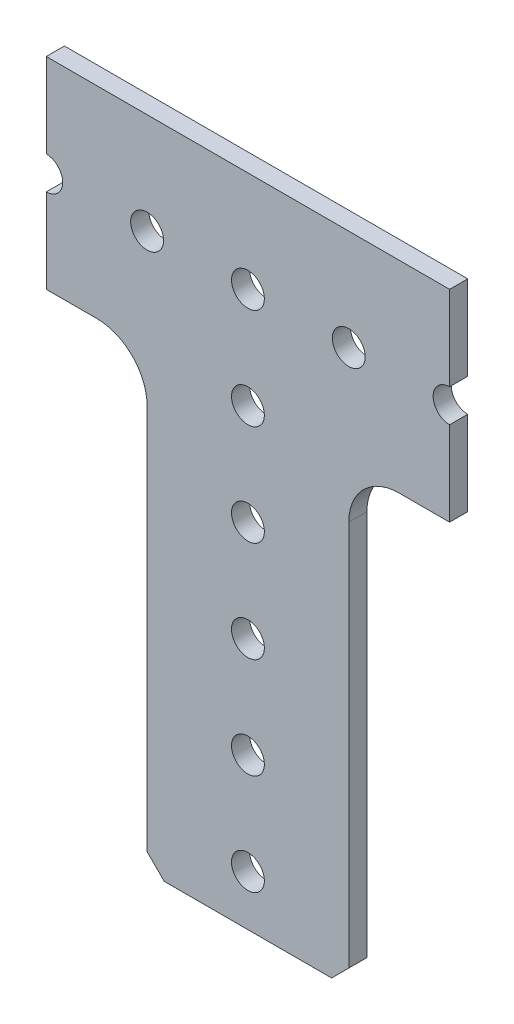
ISO-10303-21;
HEADER;
FILE_DESCRIPTION(('STEP AP214'),'2;1');
FILE_NAME('part.step','',(''),(''),'','','');
FILE_SCHEMA(('AUTOMOTIVE_DESIGN { 1 0 10303 214 1 1 1 1 }'));
ENDSEC;
DATA;
#1=APPLICATION_CONTEXT('core data for automotive mechanical design processes');
#2=APPLICATION_PROTOCOL_DEFINITION('international standard','automotive_design',2000,#1);
#3=PRODUCT_CONTEXT('',#1,'mechanical');
#4=PRODUCT('Part','Part','',(#3));
#5=PRODUCT_RELATED_PRODUCT_CATEGORY('part','',(#4));
#6=PRODUCT_DEFINITION_FORMATION('','',#4);
#7=PRODUCT_DEFINITION_CONTEXT('part definition',#1,'design');
#8=PRODUCT_DEFINITION('design','',#6,#7);
#9=PRODUCT_DEFINITION_SHAPE('','',#8);
#10=(LENGTH_UNIT() NAMED_UNIT(*) SI_UNIT(.MILLI.,.METRE.));
#11=(NAMED_UNIT(*) PLANE_ANGLE_UNIT() SI_UNIT($,.RADIAN.));
#12=(NAMED_UNIT(*) SI_UNIT($,.STERADIAN.) SOLID_ANGLE_UNIT());
#13=UNCERTAINTY_MEASURE_WITH_UNIT(LENGTH_MEASURE(1.E-05),#10,'distance_accuracy_value','');
#14=(GEOMETRIC_REPRESENTATION_CONTEXT(3) GLOBAL_UNCERTAINTY_ASSIGNED_CONTEXT((#13)) GLOBAL_UNIT_ASSIGNED_CONTEXT((#10,
#11,#12)) REPRESENTATION_CONTEXT('',''));
#15=CARTESIAN_POINT('',(0.,0.,0.));
#16=DIRECTION('',(0.,0.,1.));
#17=DIRECTION('',(1.,0.,0.));
#18=AXIS2_PLACEMENT_3D('',#15,#16,#17);
#19=CARTESIAN_POINT('',(44.45,-57.15,2.286));
#20=DIRECTION('',(0.,0.,1.));
#21=DIRECTION('',(1.,0.,0.));
#22=AXIS2_PLACEMENT_3D('',#19,#20,#21);
#23=PLANE('',#22);
#24=CARTESIAN_POINT('',(0.,-38.1,2.286));
#25=DIRECTION('',(0.,0.,-1.));
#26=DIRECTION('',(-1.,0.,0.));
#27=AXIS2_PLACEMENT_3D('',#24,#25,#26);
#28=CIRCLE('',#27,2.0701);
#29=CARTESIAN_POINT('',(-2.0701,-38.1,2.286));
#30=VERTEX_POINT('',#29);
#31=EDGE_CURVE('E307',#30,#30,#28,.T.);
#32=ORIENTED_EDGE('',*,*,#31,.T.);
#33=EDGE_LOOP('',(#32));
#34=FACE_BOUND('',#33,.T.);
#35=CARTESIAN_POINT('',(0.,-12.7,2.286));
#36=DIRECTION('',(0.,0.,-1.));
#37=DIRECTION('',(-1.,0.,0.));
#38=AXIS2_PLACEMENT_3D('',#35,#36,#37);
#39=CIRCLE('',#38,2.0701);
#40=CARTESIAN_POINT('',(-2.0701,-12.7,2.286));
#41=VERTEX_POINT('',#40);
#42=EDGE_CURVE('E310',#41,#41,#39,.T.);
#43=ORIENTED_EDGE('',*,*,#42,.T.);
#44=EDGE_LOOP('',(#43));
#45=FACE_BOUND('',#44,.T.);
#46=CARTESIAN_POINT('',(12.7,12.7,2.286));
#47=DIRECTION('',(0.,0.,-1.));
#48=DIRECTION('',(-1.,0.,0.));
#49=AXIS2_PLACEMENT_3D('',#46,#47,#48);
#50=CIRCLE('',#49,2.0701);
#51=CARTESIAN_POINT('',(10.6299,12.7,2.286));
#52=VERTEX_POINT('',#51);
#53=EDGE_CURVE('E313',#52,#52,#50,.T.);
#54=ORIENTED_EDGE('',*,*,#53,.T.);
#55=EDGE_LOOP('',(#54));
#56=FACE_BOUND('',#55,.T.);
#57=CARTESIAN_POINT('',(-12.7,12.7,2.286));
#58=DIRECTION('',(0.,0.,-1.));
#59=DIRECTION('',(-1.,0.,0.));
#60=AXIS2_PLACEMENT_3D('',#57,#58,#59);
#61=CIRCLE('',#60,2.0701);
#62=CARTESIAN_POINT('',(-14.7701,12.7,2.286));
#63=VERTEX_POINT('',#62);
#64=EDGE_CURVE('E316',#63,#63,#61,.T.);
#65=ORIENTED_EDGE('',*,*,#64,.T.);
#66=EDGE_LOOP('',(#65));
#67=FACE_BOUND('',#66,.T.);
#68=CARTESIAN_POINT('',(0.,12.7,2.286));
#69=DIRECTION('',(0.,0.,-1.));
#70=DIRECTION('',(-1.,0.,0.));
#71=AXIS2_PLACEMENT_3D('',#68,#69,#70);
#72=CIRCLE('',#71,2.0701);
#73=CARTESIAN_POINT('',(-2.0701,12.7,2.286));
#74=VERTEX_POINT('',#73);
#75=EDGE_CURVE('E322',#74,#74,#72,.T.);
#76=ORIENTED_EDGE('',*,*,#75,.T.);
#77=EDGE_LOOP('',(#76));
#78=FACE_BOUND('',#77,.T.);
#79=CARTESIAN_POINT('',(0.,0.,2.286));
#80=DIRECTION('',(0.,0.,-1.));
#81=DIRECTION('',(-1.,0.,0.));
#82=AXIS2_PLACEMENT_3D('',#79,#80,#81);
#83=CIRCLE('',#82,2.0701);
#84=CARTESIAN_POINT('',(-2.0701,0.,2.286));
#85=VERTEX_POINT('',#84);
#86=EDGE_CURVE('E327',#85,#85,#83,.T.);
#87=ORIENTED_EDGE('',*,*,#86,.T.);
#88=EDGE_LOOP('',(#87));
#89=FACE_BOUND('',#88,.T.);
#90=CARTESIAN_POINT('',(0.,-25.4,2.286));
#91=DIRECTION('',(0.,0.,-1.));
#92=DIRECTION('',(-1.,0.,0.));
#93=AXIS2_PLACEMENT_3D('',#90,#91,#92);
#94=CIRCLE('',#93,2.0701);
#95=CARTESIAN_POINT('',(-2.0701,-25.4,2.286));
#96=VERTEX_POINT('',#95);
#97=EDGE_CURVE('E329',#96,#96,#94,.T.);
#98=ORIENTED_EDGE('',*,*,#97,.T.);
#99=EDGE_LOOP('',(#98));
#100=FACE_BOUND('',#99,.T.);
#101=CARTESIAN_POINT('',(0.,-50.8,2.286));
#102=DIRECTION('',(0.,0.,-1.));
#103=DIRECTION('',(-1.,0.,0.));
#104=AXIS2_PLACEMENT_3D('',#101,#102,#103);
#105=CIRCLE('',#104,2.0701);
#106=CARTESIAN_POINT('',(-2.07009999999999,-50.8,2.286));
#107=VERTEX_POINT('',#106);
#108=EDGE_CURVE('E226',#107,#107,#105,.T.);
#109=ORIENTED_EDGE('',*,*,#108,.T.);
#110=EDGE_LOOP('',(#109));
#111=FACE_BOUND('',#110,.T.);
#112=DIRECTION('',(-1.,0.,0.));
#113=VECTOR('',#112,1.);
#114=CARTESIAN_POINT('',(0.,0.,2.286));
#115=LINE('',#114,#113);
#116=CARTESIAN_POINT('',(19.05,0.,2.286));
#117=VERTEX_POINT('',#116);
#118=CARTESIAN_POINT('',(25.4000000000024,0.,2.286));
#119=VERTEX_POINT('',#118);
#120=EDGE_CURVE('E236',#117,#119,#115,.F.);
#121=ORIENTED_EDGE('',*,*,#120,.T.);
#122=DIRECTION('',(0.,1.,0.));
#123=VECTOR('',#122,1.);
#124=CARTESIAN_POINT('',(25.4000000000021,-57.1499999999999,2.286));
#125=LINE('',#124,#123);
#126=CARTESIAN_POINT('',(25.4000000000024,10.6299,2.286));
#127=VERTEX_POINT('',#126);
#128=EDGE_CURVE('E173',#119,#127,#125,.T.);
#129=ORIENTED_EDGE('',*,*,#128,.T.);
#130=CARTESIAN_POINT('',(25.4,12.7,2.286));
#131=DIRECTION('',(0.,0.,-1.));
#132=DIRECTION('',(-1.,0.,0.));
#133=AXIS2_PLACEMENT_3D('',#130,#131,#132);
#134=CIRCLE('',#133,2.0701);
#135=CARTESIAN_POINT('',(25.4000000000025,14.7701,2.286));
#136=VERTEX_POINT('',#135);
#137=EDGE_CURVE('E325',#127,#136,#134,.T.);
#138=ORIENTED_EDGE('',*,*,#137,.T.);
#139=CARTESIAN_POINT('',(25.4000000000025,25.4,2.286));
#140=VERTEX_POINT('',#139);
#141=EDGE_CURVE('E54',#136,#140,#125,.T.);
#142=ORIENTED_EDGE('',*,*,#141,.T.);
#143=DIRECTION('',(1.,0.,0.));
#144=VECTOR('',#143,1.);
#145=CARTESIAN_POINT('',(-44.45,25.4,2.286));
#146=LINE('',#145,#144);
#147=CARTESIAN_POINT('',(-25.3999999993521,25.4,2.286));
#148=VERTEX_POINT('',#147);
#149=EDGE_CURVE('E40',#140,#148,#146,.F.);
#150=ORIENTED_EDGE('',*,*,#149,.T.);
#151=DIRECTION('',(0.,-1.,0.));
#152=VECTOR('',#151,1.);
#153=CARTESIAN_POINT('',(-25.3999999993528,-57.1499999999993,2.286));
#154=LINE('',#153,#152);
#155=CARTESIAN_POINT('',(-25.3999999993522,14.7701,2.286));
#156=VERTEX_POINT('',#155);
#157=EDGE_CURVE('E197',#148,#156,#154,.T.);
#158=ORIENTED_EDGE('',*,*,#157,.T.);
#159=CARTESIAN_POINT('',(-25.4,12.7,2.286));
#160=DIRECTION('',(0.,0.,-1.));
#161=DIRECTION('',(-1.,0.,0.));
#162=AXIS2_PLACEMENT_3D('',#159,#160,#161);
#163=CIRCLE('',#162,2.0701);
#164=CARTESIAN_POINT('',(-25.3999999993522,10.6299,2.286));
#165=VERTEX_POINT('',#164);
#166=EDGE_CURVE('E319',#156,#165,#163,.T.);
#167=ORIENTED_EDGE('',*,*,#166,.T.);
#168=CARTESIAN_POINT('',(-25.3999999993523,0.,2.286));
#169=VERTEX_POINT('',#168);
#170=EDGE_CURVE('E194',#165,#169,#154,.T.);
#171=ORIENTED_EDGE('',*,*,#170,.T.);
#172=DIRECTION('',(1.,0.,0.));
#173=VECTOR('',#172,1.);
#174=CARTESIAN_POINT('',(0.,0.,2.286));
#175=LINE('',#174,#173);
#176=CARTESIAN_POINT('',(-19.05,0.,2.286));
#177=VERTEX_POINT('',#176);
#178=EDGE_CURVE('E268',#177,#169,#175,.F.);
#179=ORIENTED_EDGE('',*,*,#178,.F.);
#180=CARTESIAN_POINT('',(-19.05,-6.34999999999999,2.286));
#181=DIRECTION('',(0.,0.,1.));
#182=DIRECTION('',(1.,0.,0.));
#183=AXIS2_PLACEMENT_3D('',#180,#181,#182);
#184=CIRCLE('',#183,6.35000000000001);
#185=CARTESIAN_POINT('',(-12.7,-6.34999999999998,2.286));
#186=VERTEX_POINT('',#185);
#187=EDGE_CURVE('E265',#177,#186,#184,.F.);
#188=ORIENTED_EDGE('',*,*,#187,.T.);
#189=DIRECTION('',(0.,-1.,0.));
#190=VECTOR('',#189,1.);
#191=CARTESIAN_POINT('',(-12.7,0.,2.286));
#192=LINE('',#191,#190);
#193=CARTESIAN_POINT('',(-12.7,-54.991,2.286));
#194=VERTEX_POINT('',#193);
#195=EDGE_CURVE('E263',#194,#186,#192,.F.);
#196=ORIENTED_EDGE('',*,*,#195,.F.);
#197=DIRECTION('',(0.707106781186547,-0.707106781186548,0.));
#198=VECTOR('',#197,1.);
#199=CARTESIAN_POINT('',(-10.541,-57.15,2.286));
#200=LINE('',#199,#198);
#201=CARTESIAN_POINT('',(-10.541,-57.15,2.286));
#202=VERTEX_POINT('',#201);
#203=EDGE_CURVE('E257',#202,#194,#200,.F.);
#204=ORIENTED_EDGE('',*,*,#203,.F.);
#205=DIRECTION('',(1.,0.,0.));
#206=VECTOR('',#205,1.);
#207=CARTESIAN_POINT('',(-12.7,-57.15,2.286));
#208=LINE('',#207,#206);
#209=CARTESIAN_POINT('',(10.541,-57.15,2.286));
#210=VERTEX_POINT('',#209);
#211=EDGE_CURVE('E252',#202,#210,#208,.T.);
#212=ORIENTED_EDGE('',*,*,#211,.T.);
#213=DIRECTION('',(-0.707106781186547,-0.707106781186548,0.));
#214=VECTOR('',#213,1.);
#215=CARTESIAN_POINT('',(12.7,-54.991,2.286));
#216=LINE('',#215,#214);
#217=CARTESIAN_POINT('',(12.7,-54.991,2.286));
#218=VERTEX_POINT('',#217);
#219=EDGE_CURVE('E247',#210,#218,#216,.F.);
#220=ORIENTED_EDGE('',*,*,#219,.T.);
#221=DIRECTION('',(0.,1.,0.));
#222=VECTOR('',#221,1.);
#223=CARTESIAN_POINT('',(12.7,0.,2.286));
#224=LINE('',#223,#222);
#225=CARTESIAN_POINT('',(12.7,-6.34999999999998,2.286));
#226=VERTEX_POINT('',#225);
#227=EDGE_CURVE('E241',#218,#226,#224,.T.);
#228=ORIENTED_EDGE('',*,*,#227,.T.);
#229=CARTESIAN_POINT('',(19.05,-6.34999999999998,2.286));
#230=DIRECTION('',(0.,0.,1.));
#231=DIRECTION('',(1.,0.,0.));
#232=AXIS2_PLACEMENT_3D('',#229,#230,#231);
#233=CIRCLE('',#232,6.35000000000001);
#234=EDGE_CURVE('E303',#226,#117,#233,.F.);
#235=ORIENTED_EDGE('',*,*,#234,.T.);
#236=EDGE_LOOP('',(#121,#129,#138,#142,#150,#158,#167,#171,#179,#188,#196,#204,#212,#220,#228,#235));
#237=FACE_BOUND('',#236,.T.);
#238=ADVANCED_FACE('F37',(#34,#45,#56,#67,#78,#89,#100,#111,#237),#23,.T.);
#239=CARTESIAN_POINT('',(-44.45,25.4,2.286));
#240=DIRECTION('',(0.,-1.,0.));
#241=DIRECTION('',(0.,0.,-1.));
#242=AXIS2_PLACEMENT_3D('',#239,#240,#241);
#243=PLANE('',#242);
#244=DIRECTION('',(0.,0.,1.));
#245=VECTOR('',#244,1.);
#246=CARTESIAN_POINT('',(25.4000000000025,25.4,2.28600000000027));
#247=LINE('',#246,#245);
#248=CARTESIAN_POINT('',(25.4000000000025,25.4,0.));
#249=VERTEX_POINT('',#248);
#250=EDGE_CURVE('E61',#249,#140,#247,.T.);
#251=ORIENTED_EDGE('',*,*,#250,.F.);
#252=DIRECTION('',(1.,0.,0.));
#253=VECTOR('',#252,1.);
#254=CARTESIAN_POINT('',(44.45,25.4,0.));
#255=LINE('',#254,#253);
#256=CARTESIAN_POINT('',(-25.3999999993521,25.4,0.));
#257=VERTEX_POINT('',#256);
#258=EDGE_CURVE('E225',#249,#257,#255,.F.);
#259=ORIENTED_EDGE('',*,*,#258,.T.);
#260=DIRECTION('',(0.,0.,-1.));
#261=VECTOR('',#260,1.);
#262=CARTESIAN_POINT('',(-25.3999999993521,25.4,2.286));
#263=LINE('',#262,#261);
#264=EDGE_CURVE('E196',#148,#257,#263,.T.);
#265=ORIENTED_EDGE('',*,*,#264,.F.);
#266=ORIENTED_EDGE('',*,*,#149,.F.);
#267=EDGE_LOOP('',(#251,#259,#265,#266));
#268=FACE_BOUND('',#267,.T.);
#269=ADVANCED_FACE('F421',(#268),#243,.F.);
#270=CARTESIAN_POINT('',(44.45,-57.15,0.));
#271=DIRECTION('',(0.,0.,1.));
#272=DIRECTION('',(1.,0.,0.));
#273=AXIS2_PLACEMENT_3D('',#270,#271,#272);
#274=PLANE('',#273);
#275=CARTESIAN_POINT('',(0.,-38.1,0.));
#276=DIRECTION('',(0.,0.,-1.));
#277=DIRECTION('',(-1.,0.,0.));
#278=AXIS2_PLACEMENT_3D('',#275,#276,#277);
#279=CIRCLE('',#278,2.0701);
#280=CARTESIAN_POINT('',(-2.0701,-38.1,0.));
#281=VERTEX_POINT('',#280);
#282=EDGE_CURVE('E230',#281,#281,#279,.T.);
#283=ORIENTED_EDGE('',*,*,#282,.F.);
#284=EDGE_LOOP('',(#283));
#285=FACE_BOUND('',#284,.T.);
#286=CARTESIAN_POINT('',(0.,-12.7,0.));
#287=DIRECTION('',(0.,0.,-1.));
#288=DIRECTION('',(-1.,0.,0.));
#289=AXIS2_PLACEMENT_3D('',#286,#287,#288);
#290=CIRCLE('',#289,2.0701);
#291=CARTESIAN_POINT('',(-2.0701,-12.7,0.));
#292=VERTEX_POINT('',#291);
#293=EDGE_CURVE('E279',#292,#292,#290,.T.);
#294=ORIENTED_EDGE('',*,*,#293,.F.);
#295=EDGE_LOOP('',(#294));
#296=FACE_BOUND('',#295,.T.);
#297=CARTESIAN_POINT('',(12.7,12.7,0.));
#298=DIRECTION('',(0.,0.,-1.));
#299=DIRECTION('',(-1.,0.,0.));
#300=AXIS2_PLACEMENT_3D('',#297,#298,#299);
#301=CIRCLE('',#300,2.0701);
#302=CARTESIAN_POINT('',(10.6299,12.7,0.));
#303=VERTEX_POINT('',#302);
#304=EDGE_CURVE('E282',#303,#303,#301,.T.);
#305=ORIENTED_EDGE('',*,*,#304,.F.);
#306=EDGE_LOOP('',(#305));
#307=FACE_BOUND('',#306,.T.);
#308=CARTESIAN_POINT('',(-12.7,12.7,0.));
#309=DIRECTION('',(0.,0.,-1.));
#310=DIRECTION('',(-1.,0.,0.));
#311=AXIS2_PLACEMENT_3D('',#308,#309,#310);
#312=CIRCLE('',#311,2.0701);
#313=CARTESIAN_POINT('',(-14.7701,12.7,0.));
#314=VERTEX_POINT('',#313);
#315=EDGE_CURVE('E285',#314,#314,#312,.T.);
#316=ORIENTED_EDGE('',*,*,#315,.F.);
#317=EDGE_LOOP('',(#316));
#318=FACE_BOUND('',#317,.T.);
#319=CARTESIAN_POINT('',(0.,12.7,0.));
#320=DIRECTION('',(0.,0.,-1.));
#321=DIRECTION('',(-1.,0.,0.));
#322=AXIS2_PLACEMENT_3D('',#319,#320,#321);
#323=CIRCLE('',#322,2.0701);
#324=CARTESIAN_POINT('',(-2.0701,12.7,0.));
#325=VERTEX_POINT('',#324);
#326=EDGE_CURVE('E291',#325,#325,#323,.T.);
#327=ORIENTED_EDGE('',*,*,#326,.F.);
#328=EDGE_LOOP('',(#327));
#329=FACE_BOUND('',#328,.T.);
#330=CARTESIAN_POINT('',(0.,0.,0.));
#331=DIRECTION('',(0.,0.,-1.));
#332=DIRECTION('',(-1.,0.,0.));
#333=AXIS2_PLACEMENT_3D('',#330,#331,#332);
#334=CIRCLE('',#333,2.0701);
#335=CARTESIAN_POINT('',(-2.0701,0.,0.));
#336=VERTEX_POINT('',#335);
#337=EDGE_CURVE('E295',#336,#336,#334,.T.);
#338=ORIENTED_EDGE('',*,*,#337,.F.);
#339=EDGE_LOOP('',(#338));
#340=FACE_BOUND('',#339,.T.);
#341=CARTESIAN_POINT('',(0.,-25.4,0.));
#342=DIRECTION('',(0.,0.,-1.));
#343=DIRECTION('',(-1.,0.,0.));
#344=AXIS2_PLACEMENT_3D('',#341,#342,#343);
#345=CIRCLE('',#344,2.0701);
#346=CARTESIAN_POINT('',(-2.0701,-25.4,0.));
#347=VERTEX_POINT('',#346);
#348=EDGE_CURVE('E298',#347,#347,#345,.T.);
#349=ORIENTED_EDGE('',*,*,#348,.F.);
#350=EDGE_LOOP('',(#349));
#351=FACE_BOUND('',#350,.T.);
#352=CARTESIAN_POINT('',(0.,-50.8,0.));
#353=DIRECTION('',(0.,0.,-1.));
#354=DIRECTION('',(-1.,0.,0.));
#355=AXIS2_PLACEMENT_3D('',#352,#353,#354);
#356=CIRCLE('',#355,2.0701);
#357=CARTESIAN_POINT('',(-2.07009999999999,-50.8,0.));
#358=VERTEX_POINT('',#357);
#359=EDGE_CURVE('E238',#358,#358,#356,.T.);
#360=ORIENTED_EDGE('',*,*,#359,.F.);
#361=EDGE_LOOP('',(#360));
#362=FACE_BOUND('',#361,.T.);
#363=DIRECTION('',(0.,1.,0.));
#364=VECTOR('',#363,1.);
#365=CARTESIAN_POINT('',(25.4000000000021,-57.1499999999999,0.));
#366=LINE('',#365,#364);
#367=CARTESIAN_POINT('',(25.4000000000024,0.,0.));
#368=VERTEX_POINT('',#367);
#369=CARTESIAN_POINT('',(25.4000000000024,10.6299,0.));
#370=VERTEX_POINT('',#369);
#371=EDGE_CURVE('E167',#368,#370,#366,.T.);
#372=ORIENTED_EDGE('',*,*,#371,.F.);
#373=DIRECTION('',(1.,0.,0.));
#374=VECTOR('',#373,1.);
#375=CARTESIAN_POINT('',(44.45,0.,0.));
#376=LINE('',#375,#374);
#377=CARTESIAN_POINT('',(19.05,0.,0.));
#378=VERTEX_POINT('',#377);
#379=EDGE_CURVE('E152',#378,#368,#376,.T.);
#380=ORIENTED_EDGE('',*,*,#379,.F.);
#381=CARTESIAN_POINT('',(19.05,-6.34999999999998,0.));
#382=DIRECTION('',(0.,0.,1.));
#383=DIRECTION('',(1.,0.,0.));
#384=AXIS2_PLACEMENT_3D('',#381,#382,#383);
#385=CIRCLE('',#384,6.35000000000001);
#386=CARTESIAN_POINT('',(12.7,-6.34999999999998,0.));
#387=VERTEX_POINT('',#386);
#388=EDGE_CURVE('E163',#387,#378,#385,.F.);
#389=ORIENTED_EDGE('',*,*,#388,.F.);
#390=DIRECTION('',(0.,1.,0.));
#391=VECTOR('',#390,1.);
#392=CARTESIAN_POINT('',(12.7,-57.15,0.));
#393=LINE('',#392,#391);
#394=CARTESIAN_POINT('',(12.7,-54.991,0.));
#395=VERTEX_POINT('',#394);
#396=EDGE_CURVE('E205',#395,#387,#393,.T.);
#397=ORIENTED_EDGE('',*,*,#396,.F.);
#398=DIRECTION('',(0.707106781186547,0.707106781186547,0.));
#399=VECTOR('',#398,1.);
#400=CARTESIAN_POINT('',(10.541,-57.15,0.));
#401=LINE('',#400,#399);
#402=CARTESIAN_POINT('',(10.541,-57.15,0.));
#403=VERTEX_POINT('',#402);
#404=EDGE_CURVE('E208',#403,#395,#401,.T.);
#405=ORIENTED_EDGE('',*,*,#404,.F.);
#406=DIRECTION('',(1.,0.,0.));
#407=VECTOR('',#406,1.);
#408=CARTESIAN_POINT('',(44.45,-57.15,0.));
#409=LINE('',#408,#407);
#410=CARTESIAN_POINT('',(-10.541,-57.15,0.));
#411=VERTEX_POINT('',#410);
#412=EDGE_CURVE('E374',#411,#403,#409,.T.);
#413=ORIENTED_EDGE('',*,*,#412,.F.);
#414=DIRECTION('',(0.707106781186547,-0.707106781186547,0.));
#415=VECTOR('',#414,1.);
#416=CARTESIAN_POINT('',(-12.7,-54.991,0.));
#417=LINE('',#416,#415);
#418=CARTESIAN_POINT('',(-12.7,-54.991,0.));
#419=VERTEX_POINT('',#418);
#420=EDGE_CURVE('E214',#419,#411,#417,.T.);
#421=ORIENTED_EDGE('',*,*,#420,.F.);
#422=DIRECTION('',(0.,1.,0.));
#423=VECTOR('',#422,1.);
#424=CARTESIAN_POINT('',(-12.7,-57.15,0.));
#425=LINE('',#424,#423);
#426=CARTESIAN_POINT('',(-12.7,-6.34999999999999,0.));
#427=VERTEX_POINT('',#426);
#428=EDGE_CURVE('E211',#427,#419,#425,.F.);
#429=ORIENTED_EDGE('',*,*,#428,.F.);
#430=CARTESIAN_POINT('',(-19.05,-6.34999999999999,0.));
#431=DIRECTION('',(0.,0.,1.));
#432=DIRECTION('',(1.,0.,0.));
#433=AXIS2_PLACEMENT_3D('',#430,#431,#432);
#434=CIRCLE('',#433,6.35000000000001);
#435=CARTESIAN_POINT('',(-19.05,0.,0.));
#436=VERTEX_POINT('',#435);
#437=EDGE_CURVE('E215',#436,#427,#434,.F.);
#438=ORIENTED_EDGE('',*,*,#437,.F.);
#439=DIRECTION('',(1.,0.,0.));
#440=VECTOR('',#439,1.);
#441=CARTESIAN_POINT('',(44.45,0.,0.));
#442=LINE('',#441,#440);
#443=CARTESIAN_POINT('',(-25.3999999993523,0.,0.));
#444=VERTEX_POINT('',#443);
#445=EDGE_CURVE('E222',#444,#436,#442,.T.);
#446=ORIENTED_EDGE('',*,*,#445,.F.);
#447=DIRECTION('',(0.,-1.,0.));
#448=VECTOR('',#447,1.);
#449=CARTESIAN_POINT('',(-25.3999999993528,-57.1499999999993,0.));
#450=LINE('',#449,#448);
#451=CARTESIAN_POINT('',(-25.3999999993522,10.6299,0.));
#452=VERTEX_POINT('',#451);
#453=EDGE_CURVE('E162',#452,#444,#450,.T.);
#454=ORIENTED_EDGE('',*,*,#453,.F.);
#455=CARTESIAN_POINT('',(-25.4,12.7,0.));
#456=DIRECTION('',(0.,0.,-1.));
#457=DIRECTION('',(-1.,0.,0.));
#458=AXIS2_PLACEMENT_3D('',#455,#456,#457);
#459=CIRCLE('',#458,2.0701);
#460=CARTESIAN_POINT('',(-25.3999999993522,14.7701,0.));
#461=VERTEX_POINT('',#460);
#462=EDGE_CURVE('E288',#461,#452,#459,.T.);
#463=ORIENTED_EDGE('',*,*,#462,.F.);
#464=EDGE_CURVE('E46',#257,#461,#450,.T.);
#465=ORIENTED_EDGE('',*,*,#464,.F.);
#466=ORIENTED_EDGE('',*,*,#258,.F.);
#467=CARTESIAN_POINT('',(25.4000000000025,14.7701,0.));
#468=VERTEX_POINT('',#467);
#469=EDGE_CURVE('E175',#468,#249,#366,.T.);
#470=ORIENTED_EDGE('',*,*,#469,.F.);
#471=CARTESIAN_POINT('',(25.4,12.7,0.));
#472=DIRECTION('',(0.,0.,-1.));
#473=DIRECTION('',(-1.,0.,0.));
#474=AXIS2_PLACEMENT_3D('',#471,#472,#473);
#475=CIRCLE('',#474,2.0701);
#476=EDGE_CURVE('E170',#370,#468,#475,.T.);
#477=ORIENTED_EDGE('',*,*,#476,.F.);
#478=EDGE_LOOP('',(#372,#380,#389,#397,#405,#413,#421,#429,#438,#446,#454,#463,#465,#466,#470,#477));
#479=FACE_BOUND('',#478,.T.);
#480=ADVANCED_FACE('F168',(#285,#296,#307,#318,#329,#340,#351,#362,#479),#274,.F.);
#481=CARTESIAN_POINT('',(25.4,12.7,2.286));
#482=DIRECTION('',(0.,0.,-1.));
#483=DIRECTION('',(-1.,0.,0.));
#484=AXIS2_PLACEMENT_3D('',#481,#482,#483);
#485=CYLINDRICAL_SURFACE('',#484,2.0701);
#486=DIRECTION('',(0.,0.,-1.));
#487=VECTOR('',#486,1.);
#488=CARTESIAN_POINT('',(25.4000000000024,10.6299,2.286));
#489=LINE('',#488,#487);
#490=EDGE_CURVE('E178',#370,#127,#489,.F.);
#491=ORIENTED_EDGE('',*,*,#490,.F.);
#492=ORIENTED_EDGE('',*,*,#476,.T.);
#493=DIRECTION('',(0.,0.,-1.));
#494=VECTOR('',#493,1.);
#495=CARTESIAN_POINT('',(25.4000000000025,14.7701,2.286));
#496=LINE('',#495,#494);
#497=EDGE_CURVE('E181',#136,#468,#496,.T.);
#498=ORIENTED_EDGE('',*,*,#497,.F.);
#499=ORIENTED_EDGE('',*,*,#137,.F.);
#500=EDGE_LOOP('',(#491,#492,#498,#499));
#501=FACE_BOUND('',#500,.T.);
#502=ADVANCED_FACE('F459',(#501),#485,.F.);
#503=CARTESIAN_POINT('',(0.,0.,0.));
#504=DIRECTION('',(0.,1.,0.));
#505=DIRECTION('',(-1.,0.,0.));
#506=AXIS2_PLACEMENT_3D('',#503,#504,#505);
#507=PLANE('',#506);
#508=DIRECTION('',(0.,0.,-1.));
#509=VECTOR('',#508,1.);
#510=CARTESIAN_POINT('',(25.4000000000024,0.,0.));
#511=LINE('',#510,#509);
#512=EDGE_CURVE('E12',#119,#368,#511,.T.);
#513=ORIENTED_EDGE('',*,*,#512,.F.);
#514=ORIENTED_EDGE('',*,*,#120,.F.);
#515=DIRECTION('',(0.,0.,1.));
#516=VECTOR('',#515,1.);
#517=CARTESIAN_POINT('',(19.05,0.,0.));
#518=LINE('',#517,#516);
#519=EDGE_CURVE('E158',#378,#117,#518,.T.);
#520=ORIENTED_EDGE('',*,*,#519,.F.);
#521=ORIENTED_EDGE('',*,*,#379,.T.);
#522=EDGE_LOOP('',(#513,#514,#520,#521));
#523=FACE_BOUND('',#522,.T.);
#524=ADVANCED_FACE('F154',(#523),#507,.F.);
#525=CARTESIAN_POINT('',(-25.4,12.7,2.286));
#526=DIRECTION('',(0.,0.,-1.));
#527=DIRECTION('',(-1.,0.,0.));
#528=AXIS2_PLACEMENT_3D('',#525,#526,#527);
#529=CYLINDRICAL_SURFACE('',#528,2.0701);
#530=DIRECTION('',(0.,0.,-1.));
#531=VECTOR('',#530,1.);
#532=CARTESIAN_POINT('',(-25.3999999993522,14.7701,2.286));
#533=LINE('',#532,#531);
#534=EDGE_CURVE('E200',#461,#156,#533,.F.);
#535=ORIENTED_EDGE('',*,*,#534,.F.);
#536=ORIENTED_EDGE('',*,*,#462,.T.);
#537=DIRECTION('',(0.,0.,-1.));
#538=VECTOR('',#537,1.);
#539=CARTESIAN_POINT('',(-25.3999999993522,10.6299,2.286));
#540=LINE('',#539,#538);
#541=EDGE_CURVE('E185',#165,#452,#540,.T.);
#542=ORIENTED_EDGE('',*,*,#541,.F.);
#543=ORIENTED_EDGE('',*,*,#166,.F.);
#544=EDGE_LOOP('',(#535,#536,#542,#543));
#545=FACE_BOUND('',#544,.T.);
#546=ADVANCED_FACE('F343',(#545),#529,.F.);
#547=CARTESIAN_POINT('',(0.,0.,0.));
#548=DIRECTION('',(0.,-1.,0.));
#549=DIRECTION('',(1.,0.,0.));
#550=AXIS2_PLACEMENT_3D('',#547,#548,#549);
#551=PLANE('',#550);
#552=ORIENTED_EDGE('',*,*,#178,.T.);
#553=DIRECTION('',(0.,0.,-1.));
#554=VECTOR('',#553,1.);
#555=CARTESIAN_POINT('',(-25.3999999993523,0.,0.));
#556=LINE('',#555,#554);
#557=EDGE_CURVE('E183',#169,#444,#556,.T.);
#558=ORIENTED_EDGE('',*,*,#557,.T.);
#559=ORIENTED_EDGE('',*,*,#445,.T.);
#560=DIRECTION('',(0.,0.,1.));
#561=VECTOR('',#560,1.);
#562=CARTESIAN_POINT('',(-19.05,0.,0.));
#563=LINE('',#562,#561);
#564=EDGE_CURVE('E234',#436,#177,#563,.T.);
#565=ORIENTED_EDGE('',*,*,#564,.T.);
#566=EDGE_LOOP('',(#552,#558,#559,#565));
#567=FACE_BOUND('',#566,.T.);
#568=ADVANCED_FACE('F353',(#567),#551,.T.);
#569=CARTESIAN_POINT('',(0.,-50.8,2.286));
#570=DIRECTION('',(0.,0.,-1.));
#571=DIRECTION('',(-1.,0.,0.));
#572=AXIS2_PLACEMENT_3D('',#569,#570,#571);
#573=CYLINDRICAL_SURFACE('',#572,2.0701);
#574=ORIENTED_EDGE('',*,*,#359,.T.);
#575=EDGE_LOOP('',(#574));
#576=FACE_BOUND('',#575,.T.);
#577=ORIENTED_EDGE('',*,*,#108,.F.);
#578=EDGE_LOOP('',(#577));
#579=FACE_BOUND('',#578,.T.);
#580=ADVANCED_FACE('F455',(#576,#579),#573,.F.);
#581=CARTESIAN_POINT('',(0.,-25.4,2.286));
#582=DIRECTION('',(0.,0.,-1.));
#583=DIRECTION('',(-1.,0.,0.));
#584=AXIS2_PLACEMENT_3D('',#581,#582,#583);
#585=CYLINDRICAL_SURFACE('',#584,2.0701);
#586=ORIENTED_EDGE('',*,*,#348,.T.);
#587=EDGE_LOOP('',(#586));
#588=FACE_BOUND('',#587,.T.);
#589=ORIENTED_EDGE('',*,*,#97,.F.);
#590=EDGE_LOOP('',(#589));
#591=FACE_BOUND('',#590,.T.);
#592=ADVANCED_FACE('F443',(#588,#591),#585,.F.);
#593=CARTESIAN_POINT('',(0.,0.,2.286));
#594=DIRECTION('',(0.,0.,-1.));
#595=DIRECTION('',(-1.,0.,0.));
#596=AXIS2_PLACEMENT_3D('',#593,#594,#595);
#597=CYLINDRICAL_SURFACE('',#596,2.0701);
#598=ORIENTED_EDGE('',*,*,#337,.T.);
#599=EDGE_LOOP('',(#598));
#600=FACE_BOUND('',#599,.T.);
#601=ORIENTED_EDGE('',*,*,#86,.F.);
#602=EDGE_LOOP('',(#601));
#603=FACE_BOUND('',#602,.T.);
#604=ADVANCED_FACE('F440',(#600,#603),#597,.F.);
#605=CARTESIAN_POINT('',(0.,12.7,2.286));
#606=DIRECTION('',(0.,0.,-1.));
#607=DIRECTION('',(-1.,0.,0.));
#608=AXIS2_PLACEMENT_3D('',#605,#606,#607);
#609=CYLINDRICAL_SURFACE('',#608,2.0701);
#610=ORIENTED_EDGE('',*,*,#326,.T.);
#611=EDGE_LOOP('',(#610));
#612=FACE_BOUND('',#611,.T.);
#613=ORIENTED_EDGE('',*,*,#75,.F.);
#614=EDGE_LOOP('',(#613));
#615=FACE_BOUND('',#614,.T.);
#616=ADVANCED_FACE('F442',(#612,#615),#609,.F.);
#617=CARTESIAN_POINT('',(-12.7,12.7,2.286));
#618=DIRECTION('',(0.,0.,-1.));
#619=DIRECTION('',(-1.,0.,0.));
#620=AXIS2_PLACEMENT_3D('',#617,#618,#619);
#621=CYLINDRICAL_SURFACE('',#620,2.0701);
#622=ORIENTED_EDGE('',*,*,#315,.T.);
#623=EDGE_LOOP('',(#622));
#624=FACE_BOUND('',#623,.T.);
#625=ORIENTED_EDGE('',*,*,#64,.F.);
#626=EDGE_LOOP('',(#625));
#627=FACE_BOUND('',#626,.T.);
#628=ADVANCED_FACE('F451',(#624,#627),#621,.F.);
#629=CARTESIAN_POINT('',(12.7,12.7,2.286));
#630=DIRECTION('',(0.,0.,-1.));
#631=DIRECTION('',(-1.,0.,0.));
#632=AXIS2_PLACEMENT_3D('',#629,#630,#631);
#633=CYLINDRICAL_SURFACE('',#632,2.0701);
#634=ORIENTED_EDGE('',*,*,#304,.T.);
#635=EDGE_LOOP('',(#634));
#636=FACE_BOUND('',#635,.T.);
#637=ORIENTED_EDGE('',*,*,#53,.F.);
#638=EDGE_LOOP('',(#637));
#639=FACE_BOUND('',#638,.T.);
#640=ADVANCED_FACE('F534',(#636,#639),#633,.F.);
#641=CARTESIAN_POINT('',(0.,-12.7,2.286));
#642=DIRECTION('',(0.,0.,-1.));
#643=DIRECTION('',(-1.,0.,0.));
#644=AXIS2_PLACEMENT_3D('',#641,#642,#643);
#645=CYLINDRICAL_SURFACE('',#644,2.0701);
#646=ORIENTED_EDGE('',*,*,#293,.T.);
#647=EDGE_LOOP('',(#646));
#648=FACE_BOUND('',#647,.T.);
#649=ORIENTED_EDGE('',*,*,#42,.F.);
#650=EDGE_LOOP('',(#649));
#651=FACE_BOUND('',#650,.T.);
#652=ADVANCED_FACE('F524',(#648,#651),#645,.F.);
#653=CARTESIAN_POINT('',(0.,-38.1,2.286));
#654=DIRECTION('',(0.,0.,-1.));
#655=DIRECTION('',(-1.,0.,0.));
#656=AXIS2_PLACEMENT_3D('',#653,#654,#655);
#657=CYLINDRICAL_SURFACE('',#656,2.0701);
#658=ORIENTED_EDGE('',*,*,#282,.T.);
#659=EDGE_LOOP('',(#658));
#660=FACE_BOUND('',#659,.T.);
#661=ORIENTED_EDGE('',*,*,#31,.F.);
#662=EDGE_LOOP('',(#661));
#663=FACE_BOUND('',#662,.T.);
#664=ADVANCED_FACE('F515',(#660,#663),#657,.F.);
#665=CARTESIAN_POINT('',(-19.05,-6.34999999999999,0.));
#666=DIRECTION('',(0.,0.,1.));
#667=DIRECTION('',(1.,0.,0.));
#668=AXIS2_PLACEMENT_3D('',#665,#666,#667);
#669=CYLINDRICAL_SURFACE('',#668,6.35000000000001);
#670=ORIENTED_EDGE('',*,*,#564,.F.);
#671=ORIENTED_EDGE('',*,*,#437,.T.);
#672=DIRECTION('',(0.,0.,1.));
#673=VECTOR('',#672,1.);
#674=CARTESIAN_POINT('',(-12.7,-6.34999999999999,0.));
#675=LINE('',#674,#673);
#676=EDGE_CURVE('E260',#186,#427,#675,.F.);
#677=ORIENTED_EDGE('',*,*,#676,.F.);
#678=ORIENTED_EDGE('',*,*,#187,.F.);
#679=EDGE_LOOP('',(#670,#671,#677,#678));
#680=FACE_BOUND('',#679,.T.);
#681=ADVANCED_FACE('F357',(#680),#669,.F.);
#682=CARTESIAN_POINT('',(-12.7,0.,0.));
#683=DIRECTION('',(-1.,0.,0.));
#684=DIRECTION('',(0.,-1.,0.));
#685=AXIS2_PLACEMENT_3D('',#682,#683,#684);
#686=PLANE('',#685);
#687=ORIENTED_EDGE('',*,*,#195,.T.);
#688=ORIENTED_EDGE('',*,*,#676,.T.);
#689=ORIENTED_EDGE('',*,*,#428,.T.);
#690=DIRECTION('',(0.,0.,1.));
#691=VECTOR('',#690,1.);
#692=CARTESIAN_POINT('',(-12.7,-54.991,2.286));
#693=LINE('',#692,#691);
#694=EDGE_CURVE('E259',#194,#419,#693,.F.);
#695=ORIENTED_EDGE('',*,*,#694,.F.);
#696=EDGE_LOOP('',(#687,#688,#689,#695));
#697=FACE_BOUND('',#696,.T.);
#698=ADVANCED_FACE('F365',(#697),#686,.T.);
#699=CARTESIAN_POINT('',(-10.541,-57.15,2.286));
#700=DIRECTION('',(-0.707106781186548,-0.707106781186547,0.));
#701=DIRECTION('',(0.707106781186547,-0.707106781186548,0.));
#702=AXIS2_PLACEMENT_3D('',#699,#700,#701);
#703=PLANE('',#702);
#704=ORIENTED_EDGE('',*,*,#420,.T.);
#705=DIRECTION('',(0.,0.,1.));
#706=VECTOR('',#705,1.);
#707=CARTESIAN_POINT('',(-10.541,-57.15,2.286));
#708=LINE('',#707,#706);
#709=EDGE_CURVE('E254',#411,#202,#708,.T.);
#710=ORIENTED_EDGE('',*,*,#709,.T.);
#711=ORIENTED_EDGE('',*,*,#203,.T.);
#712=ORIENTED_EDGE('',*,*,#694,.T.);
#713=EDGE_LOOP('',(#704,#710,#711,#712));
#714=FACE_BOUND('',#713,.T.);
#715=ADVANCED_FACE('F410',(#714),#703,.T.);
#716=CARTESIAN_POINT('',(-12.7,-57.15,2.286));
#717=DIRECTION('',(0.,1.,0.));
#718=DIRECTION('',(0.,0.,1.));
#719=AXIS2_PLACEMENT_3D('',#716,#717,#718);
#720=PLANE('',#719);
#721=ORIENTED_EDGE('',*,*,#709,.F.);
#722=ORIENTED_EDGE('',*,*,#412,.T.);
#723=DIRECTION('',(0.,0.,1.));
#724=VECTOR('',#723,1.);
#725=CARTESIAN_POINT('',(10.541,-57.15,0.));
#726=LINE('',#725,#724);
#727=EDGE_CURVE('E249',#403,#210,#726,.T.);
#728=ORIENTED_EDGE('',*,*,#727,.T.);
#729=ORIENTED_EDGE('',*,*,#211,.F.);
#730=EDGE_LOOP('',(#721,#722,#728,#729));
#731=FACE_BOUND('',#730,.T.);
#732=ADVANCED_FACE('F408',(#731),#720,.F.);
#733=CARTESIAN_POINT('',(12.7,-54.991,0.));
#734=DIRECTION('',(-0.707106781186548,0.707106781186547,0.));
#735=DIRECTION('',(-0.707106781186547,-0.707106781186548,0.));
#736=AXIS2_PLACEMENT_3D('',#733,#734,#735);
#737=PLANE('',#736);
#738=ORIENTED_EDGE('',*,*,#727,.F.);
#739=ORIENTED_EDGE('',*,*,#404,.T.);
#740=DIRECTION('',(0.,0.,1.));
#741=VECTOR('',#740,1.);
#742=CARTESIAN_POINT('',(12.7,-54.991,0.));
#743=LINE('',#742,#741);
#744=EDGE_CURVE('E244',#395,#218,#743,.T.);
#745=ORIENTED_EDGE('',*,*,#744,.T.);
#746=ORIENTED_EDGE('',*,*,#219,.F.);
#747=EDGE_LOOP('',(#738,#739,#745,#746));
#748=FACE_BOUND('',#747,.T.);
#749=ADVANCED_FACE('F404',(#748),#737,.F.);
#750=CARTESIAN_POINT('',(12.7,0.,0.));
#751=DIRECTION('',(-1.,0.,0.));
#752=DIRECTION('',(0.,0.,1.));
#753=AXIS2_PLACEMENT_3D('',#750,#751,#752);
#754=PLANE('',#753);
#755=ORIENTED_EDGE('',*,*,#744,.F.);
#756=ORIENTED_EDGE('',*,*,#396,.T.);
#757=DIRECTION('',(0.,0.,1.));
#758=VECTOR('',#757,1.);
#759=CARTESIAN_POINT('',(12.7,-6.34999999999998,0.));
#760=LINE('',#759,#758);
#761=EDGE_CURVE('E243',#387,#226,#760,.T.);
#762=ORIENTED_EDGE('',*,*,#761,.T.);
#763=ORIENTED_EDGE('',*,*,#227,.F.);
#764=EDGE_LOOP('',(#755,#756,#762,#763));
#765=FACE_BOUND('',#764,.T.);
#766=ADVANCED_FACE('F397',(#765),#754,.F.);
#767=CARTESIAN_POINT('',(19.05,-6.34999999999998,0.));
#768=DIRECTION('',(0.,0.,1.));
#769=DIRECTION('',(1.,0.,0.));
#770=AXIS2_PLACEMENT_3D('',#767,#768,#769);
#771=CYLINDRICAL_SURFACE('',#770,6.35000000000001);
#772=ORIENTED_EDGE('',*,*,#761,.F.);
#773=ORIENTED_EDGE('',*,*,#388,.T.);
#774=ORIENTED_EDGE('',*,*,#519,.T.);
#775=ORIENTED_EDGE('',*,*,#234,.F.);
#776=EDGE_LOOP('',(#772,#773,#774,#775));
#777=FACE_BOUND('',#776,.T.);
#778=ADVANCED_FACE('F401',(#777),#771,.F.);
#779=CARTESIAN_POINT('',(-25.3999999993523,2.32131318860211E-13,0.));
#780=DIRECTION('',(-1.,0.,0.));
#781=DIRECTION('',(0.,-1.,0.));
#782=AXIS2_PLACEMENT_3D('',#779,#780,#781);
#783=PLANE('',#782);
#784=ORIENTED_EDGE('',*,*,#170,.F.);
#785=ORIENTED_EDGE('',*,*,#541,.T.);
#786=ORIENTED_EDGE('',*,*,#453,.T.);
#787=ORIENTED_EDGE('',*,*,#557,.F.);
#788=EDGE_LOOP('',(#784,#785,#786,#787));
#789=FACE_BOUND('',#788,.T.);
#790=ADVANCED_FACE('F348',(#789),#783,.T.);
#791=ORIENTED_EDGE('',*,*,#157,.F.);
#792=ORIENTED_EDGE('',*,*,#264,.T.);
#793=ORIENTED_EDGE('',*,*,#464,.T.);
#794=ORIENTED_EDGE('',*,*,#534,.T.);
#795=EDGE_LOOP('',(#791,#792,#793,#794));
#796=FACE_BOUND('',#795,.T.);
#797=ADVANCED_FACE('F345',(#796),#783,.T.);
#798=CARTESIAN_POINT('',(25.4000000000024,-1.36382516728605E-13,0.));
#799=DIRECTION('',(1.,0.,0.));
#800=DIRECTION('',(0.,1.,0.));
#801=AXIS2_PLACEMENT_3D('',#798,#799,#800);
#802=PLANE('',#801);
#803=ORIENTED_EDGE('',*,*,#371,.T.);
#804=ORIENTED_EDGE('',*,*,#490,.T.);
#805=ORIENTED_EDGE('',*,*,#128,.F.);
#806=ORIENTED_EDGE('',*,*,#512,.T.);
#807=EDGE_LOOP('',(#803,#804,#805,#806));
#808=FACE_BOUND('',#807,.T.);
#809=ADVANCED_FACE('F177',(#808),#802,.T.);
#810=ORIENTED_EDGE('',*,*,#141,.F.);
#811=ORIENTED_EDGE('',*,*,#497,.T.);
#812=ORIENTED_EDGE('',*,*,#469,.T.);
#813=ORIENTED_EDGE('',*,*,#250,.T.);
#814=EDGE_LOOP('',(#810,#811,#812,#813));
#815=FACE_BOUND('',#814,.T.);
#816=ADVANCED_FACE('F478',(#815),#802,.T.);
#817=CLOSED_SHELL('',(#238,#269,#480,#502,#524,#546,#568,#580,#592,#604,#616,#628,#640,#652,
#664,#681,#698,#715,#732,#749,#766,#778,#790,#797,#809,#816));
#818=MANIFOLD_SOLID_BREP('B2',#817);
#819=ADVANCED_BREP_SHAPE_REPRESENTATION('',(#18,#818),#14);
#820=SHAPE_DEFINITION_REPRESENTATION(#9,#819);
ENDSEC;
END-ISO-10303-21;
